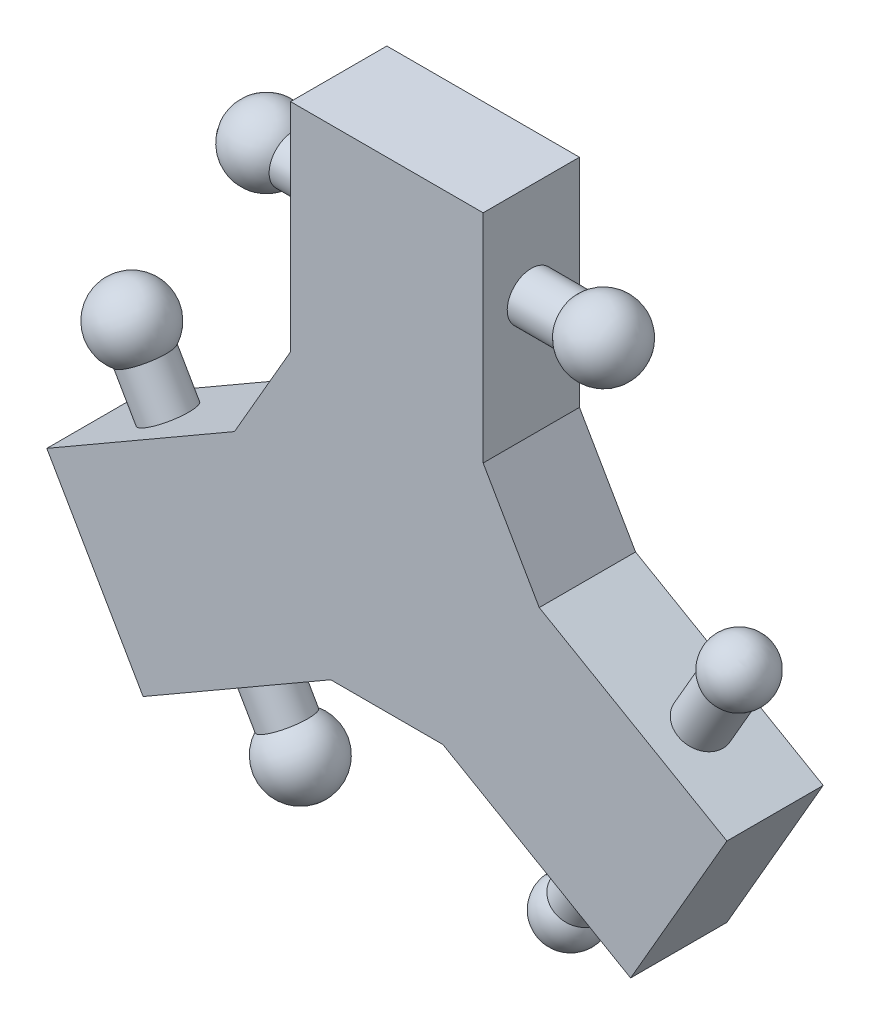
ISO-10303-21;
HEADER;
FILE_DESCRIPTION(('STEP AP214'),'2;1');
FILE_NAME('part.step','',(''),(''),'','','');
FILE_SCHEMA(('AUTOMOTIVE_DESIGN { 1 0 10303 214 1 1 1 1 }'));
ENDSEC;
DATA;
#1=APPLICATION_CONTEXT('core data for automotive mechanical design processes');
#2=APPLICATION_PROTOCOL_DEFINITION('international standard','automotive_design',2000,#1);
#3=PRODUCT_CONTEXT('',#1,'mechanical');
#4=PRODUCT('Part','Part','',(#3));
#5=PRODUCT_RELATED_PRODUCT_CATEGORY('part','',(#4));
#6=PRODUCT_DEFINITION_FORMATION('','',#4);
#7=PRODUCT_DEFINITION_CONTEXT('part definition',#1,'design');
#8=PRODUCT_DEFINITION('design','',#6,#7);
#9=PRODUCT_DEFINITION_SHAPE('','',#8);
#10=(LENGTH_UNIT() NAMED_UNIT(*) SI_UNIT(.MILLI.,.METRE.));
#11=(NAMED_UNIT(*) PLANE_ANGLE_UNIT() SI_UNIT($,.RADIAN.));
#12=(NAMED_UNIT(*) SI_UNIT($,.STERADIAN.) SOLID_ANGLE_UNIT());
#13=UNCERTAINTY_MEASURE_WITH_UNIT(LENGTH_MEASURE(1.E-05),#10,'distance_accuracy_value','');
#14=(GEOMETRIC_REPRESENTATION_CONTEXT(3) GLOBAL_UNCERTAINTY_ASSIGNED_CONTEXT((#13)) GLOBAL_UNIT_ASSIGNED_CONTEXT((#10,
#11,#12)) REPRESENTATION_CONTEXT('',''));
#15=CARTESIAN_POINT('',(0.,0.,0.));
#16=DIRECTION('',(0.,0.,1.));
#17=DIRECTION('',(1.,0.,0.));
#18=AXIS2_PLACEMENT_3D('',#15,#16,#17);
#19=CARTESIAN_POINT('',(-3.99999999999988,20.,4.));
#20=DIRECTION('',(1.,0.,0.));
#21=DIRECTION('',(0.,1.,0.));
#22=AXIS2_PLACEMENT_3D('',#19,#20,#21);
#23=PLANE('',#22);
#24=DIRECTION('',(0.,-1.,0.));
#25=VECTOR('',#24,1.);
#26=CARTESIAN_POINT('',(-3.99999999999988,20.,0.));
#27=LINE('',#26,#25);
#28=CARTESIAN_POINT('',(-3.99999999999988,20.,0.));
#29=VERTEX_POINT('',#28);
#30=CARTESIAN_POINT('',(-3.99999999999988,11.,0.));
#31=VERTEX_POINT('',#30);
#32=EDGE_CURVE('E164',#29,#31,#27,.T.);
#33=ORIENTED_EDGE('',*,*,#32,.T.);
#34=DIRECTION('',(0.,0.,-1.));
#35=VECTOR('',#34,1.);
#36=CARTESIAN_POINT('',(-3.99999999999988,11.,4.));
#37=LINE('',#36,#35);
#38=CARTESIAN_POINT('',(-3.99999999999988,11.,4.));
#39=VERTEX_POINT('',#38);
#40=EDGE_CURVE('E212',#39,#31,#37,.T.);
#41=ORIENTED_EDGE('',*,*,#40,.F.);
#42=DIRECTION('',(0.,-1.,0.));
#43=VECTOR('',#42,1.);
#44=CARTESIAN_POINT('',(-3.99999999999988,20.,4.));
#45=LINE('',#44,#43);
#46=CARTESIAN_POINT('',(-3.99999999999988,20.,4.));
#47=VERTEX_POINT('',#46);
#48=EDGE_CURVE('E187',#47,#39,#45,.T.);
#49=ORIENTED_EDGE('',*,*,#48,.F.);
#50=DIRECTION('',(0.,0.,-1.));
#51=VECTOR('',#50,1.);
#52=CARTESIAN_POINT('',(-3.99999999999988,20.,4.));
#53=LINE('',#52,#51);
#54=EDGE_CURVE('E160',#47,#29,#53,.T.);
#55=ORIENTED_EDGE('',*,*,#54,.T.);
#56=EDGE_LOOP('',(#33,#41,#49,#55));
#57=FACE_BOUND('',#56,.T.);
#58=CARTESIAN_POINT('',(-3.99999999999988,15.9999999999956,2.00000000000652));
#59=DIRECTION('',(1.,0.,0.));
#60=DIRECTION('',(0.,1.,0.));
#61=AXIS2_PLACEMENT_3D('',#58,#59,#60);
#62=CIRCLE('',#61,1.);
#63=CARTESIAN_POINT('',(-3.99999999999988,16.9999999999956,2.00000000000652));
#64=VERTEX_POINT('',#63);
#65=EDGE_CURVE('E11',#64,#64,#62,.F.);
#66=ORIENTED_EDGE('',*,*,#65,.F.);
#67=EDGE_LOOP('',(#66));
#68=FACE_BOUND('',#67,.T.);
#69=ADVANCED_FACE('F37',(#57,#68),#23,.F.);
#70=CARTESIAN_POINT('',(4.,20.,4.));
#71=DIRECTION('',(-1.,0.,0.));
#72=DIRECTION('',(0.,-1.,0.));
#73=AXIS2_PLACEMENT_3D('',#70,#71,#72);
#74=PLANE('',#73);
#75=DIRECTION('',(0.,1.,0.));
#76=VECTOR('',#75,1.);
#77=CARTESIAN_POINT('',(4.,20.,0.));
#78=LINE('',#77,#76);
#79=CARTESIAN_POINT('',(4.,11.,0.));
#80=VERTEX_POINT('',#79);
#81=CARTESIAN_POINT('',(4.,20.,0.));
#82=VERTEX_POINT('',#81);
#83=EDGE_CURVE('E99',#80,#82,#78,.T.);
#84=ORIENTED_EDGE('',*,*,#83,.T.);
#85=DIRECTION('',(0.,0.,-1.));
#86=VECTOR('',#85,1.);
#87=CARTESIAN_POINT('',(4.,20.,4.));
#88=LINE('',#87,#86);
#89=CARTESIAN_POINT('',(4.,20.,4.));
#90=VERTEX_POINT('',#89);
#91=EDGE_CURVE('E155',#90,#82,#88,.T.);
#92=ORIENTED_EDGE('',*,*,#91,.F.);
#93=DIRECTION('',(0.,1.,0.));
#94=VECTOR('',#93,1.);
#95=CARTESIAN_POINT('',(4.,20.,4.));
#96=LINE('',#95,#94);
#97=CARTESIAN_POINT('',(4.,11.,4.));
#98=VERTEX_POINT('',#97);
#99=EDGE_CURVE('E143',#98,#90,#96,.T.);
#100=ORIENTED_EDGE('',*,*,#99,.F.);
#101=DIRECTION('',(0.,0.,-1.));
#102=VECTOR('',#101,1.);
#103=CARTESIAN_POINT('',(4.,11.,4.));
#104=LINE('',#103,#102);
#105=EDGE_CURVE('E150',#98,#80,#104,.T.);
#106=ORIENTED_EDGE('',*,*,#105,.T.);
#107=EDGE_LOOP('',(#84,#92,#100,#106));
#108=FACE_BOUND('',#107,.T.);
#109=CARTESIAN_POINT('',(4.,15.9999999999956,2.00000000000653));
#110=DIRECTION('',(-1.,0.,0.));
#111=DIRECTION('',(0.,-1.,0.));
#112=AXIS2_PLACEMENT_3D('',#109,#110,#111);
#113=CIRCLE('',#112,0.999999999999983);
#114=CARTESIAN_POINT('',(4.,14.9999999999956,2.00000000000653));
#115=VERTEX_POINT('',#114);
#116=EDGE_CURVE('E50',#115,#115,#113,.F.);
#117=ORIENTED_EDGE('',*,*,#116,.F.);
#118=EDGE_LOOP('',(#117));
#119=FACE_BOUND('',#118,.T.);
#120=ADVANCED_FACE('F157',(#108,#119),#74,.F.);
#121=CARTESIAN_POINT('',(14.1243556529823,2.46410161513754,4.));
#122=DIRECTION('',(-0.5,-0.866025403784439,0.));
#123=DIRECTION('',(0.866025403784439,-0.5,0.));
#124=AXIS2_PLACEMENT_3D('',#121,#122,#123);
#125=PLANE('',#124);
#126=DIRECTION('',(-0.866025403784439,0.5,0.));
#127=VECTOR('',#126,1.);
#128=CARTESIAN_POINT('',(14.1243556529823,2.46410161513754,0.));
#129=LINE('',#128,#127);
#130=CARTESIAN_POINT('',(14.1243556529823,2.46410161513754,0.));
#131=VERTEX_POINT('',#130);
#132=CARTESIAN_POINT('',(6.33012701892232,6.96410161513754,0.));
#133=VERTEX_POINT('',#132);
#134=EDGE_CURVE('E182',#131,#133,#129,.T.);
#135=ORIENTED_EDGE('',*,*,#134,.T.);
#136=DIRECTION('',(0.,0.,-1.));
#137=VECTOR('',#136,1.);
#138=CARTESIAN_POINT('',(6.33012701892232,6.96410161513754,4.));
#139=LINE('',#138,#137);
#140=CARTESIAN_POINT('',(6.33012701892232,6.96410161513754,4.));
#141=VERTEX_POINT('',#140);
#142=EDGE_CURVE('E154',#141,#133,#139,.T.);
#143=ORIENTED_EDGE('',*,*,#142,.F.);
#144=DIRECTION('',(-0.866025403784439,0.5,0.));
#145=VECTOR('',#144,1.);
#146=CARTESIAN_POINT('',(14.1243556529823,2.46410161513754,4.));
#147=LINE('',#146,#145);
#148=CARTESIAN_POINT('',(14.1243556529823,2.46410161513754,4.));
#149=VERTEX_POINT('',#148);
#150=EDGE_CURVE('E145',#149,#141,#147,.T.);
#151=ORIENTED_EDGE('',*,*,#150,.F.);
#152=DIRECTION('',(0.,0.,-1.));
#153=VECTOR('',#152,1.);
#154=CARTESIAN_POINT('',(14.1243556529823,2.46410161513754,4.));
#155=LINE('',#154,#153);
#156=EDGE_CURVE('E191',#149,#131,#155,.T.);
#157=ORIENTED_EDGE('',*,*,#156,.T.);
#158=EDGE_LOOP('',(#135,#143,#151,#157));
#159=FACE_BOUND('',#158,.T.);
#160=CARTESIAN_POINT('',(11.0932667397321,4.21410161514022,2.00000000000478));
#161=DIRECTION('',(-0.5,-0.866025403784439,0.));
#162=DIRECTION('',(0.866025403784439,-0.5,0.));
#163=AXIS2_PLACEMENT_3D('',#160,#161,#162);
#164=CIRCLE('',#163,0.999999999999996);
#165=CARTESIAN_POINT('',(11.9592921435165,3.71410161514022,2.00000000000478));
#166=VERTEX_POINT('',#165);
#167=EDGE_CURVE('E266',#166,#166,#164,.F.);
#168=ORIENTED_EDGE('',*,*,#167,.F.);
#169=EDGE_LOOP('',(#168));
#170=FACE_BOUND('',#169,.T.);
#171=ADVANCED_FACE('F291',(#159,#170),#125,.F.);
#172=CARTESIAN_POINT('',(-14.1243556529821,2.46410161513754,4.));
#173=DIRECTION('',(0.5,-0.866025403784439,0.));
#174=DIRECTION('',(0.866025403784439,0.5,0.));
#175=AXIS2_PLACEMENT_3D('',#172,#173,#174);
#176=PLANE('',#175);
#177=DIRECTION('',(-0.866025403784439,-0.5,0.));
#178=VECTOR('',#177,1.);
#179=CARTESIAN_POINT('',(-14.1243556529821,2.46410161513754,0.));
#180=LINE('',#179,#178);
#181=CARTESIAN_POINT('',(-6.33012701892219,6.96410161513754,0.));
#182=VERTEX_POINT('',#181);
#183=CARTESIAN_POINT('',(-14.1243556529821,2.46410161513754,0.));
#184=VERTEX_POINT('',#183);
#185=EDGE_CURVE('E170',#182,#184,#180,.T.);
#186=ORIENTED_EDGE('',*,*,#185,.T.);
#187=DIRECTION('',(0.,0.,-1.));
#188=VECTOR('',#187,1.);
#189=CARTESIAN_POINT('',(-14.1243556529821,2.46410161513754,4.));
#190=LINE('',#189,#188);
#191=CARTESIAN_POINT('',(-14.1243556529821,2.46410161513754,4.));
#192=VERTEX_POINT('',#191);
#193=EDGE_CURVE('E206',#192,#184,#190,.T.);
#194=ORIENTED_EDGE('',*,*,#193,.F.);
#195=DIRECTION('',(-0.866025403784439,-0.5,0.));
#196=VECTOR('',#195,1.);
#197=CARTESIAN_POINT('',(-14.1243556529821,2.46410161513754,4.));
#198=LINE('',#197,#196);
#199=CARTESIAN_POINT('',(-6.33012701892219,6.96410161513754,4.));
#200=VERTEX_POINT('',#199);
#201=EDGE_CURVE('E574',#200,#192,#198,.T.);
#202=ORIENTED_EDGE('',*,*,#201,.F.);
#203=DIRECTION('',(0.,0.,-1.));
#204=VECTOR('',#203,1.);
#205=CARTESIAN_POINT('',(-6.33012701892219,6.96410161513754,4.));
#206=LINE('',#205,#204);
#207=EDGE_CURVE('E209',#200,#182,#206,.T.);
#208=ORIENTED_EDGE('',*,*,#207,.T.);
#209=EDGE_LOOP('',(#186,#194,#202,#208));
#210=FACE_BOUND('',#209,.T.);
#211=CARTESIAN_POINT('',(-11.093266739732,4.21410161514019,2.00000000000477));
#212=DIRECTION('',(0.5,-0.866025403784439,0.));
#213=DIRECTION('',(0.866025403784439,0.5,0.));
#214=AXIS2_PLACEMENT_3D('',#211,#212,#213);
#215=CIRCLE('',#214,1.00000000000002);
#216=CARTESIAN_POINT('',(-10.2272413359476,4.7141016151402,2.00000000000477));
#217=VERTEX_POINT('',#216);
#218=EDGE_CURVE('E220',#217,#217,#215,.F.);
#219=ORIENTED_EDGE('',*,*,#218,.F.);
#220=EDGE_LOOP('',(#219));
#221=FACE_BOUND('',#220,.T.);
#222=ADVANCED_FACE('F317',(#210,#221),#176,.F.);
#223=CARTESIAN_POINT('',(10.1243556529823,-4.46410161513786,4.));
#224=DIRECTION('',(0.5,0.866025403784439,0.));
#225=DIRECTION('',(-0.866025403784439,0.5,0.));
#226=AXIS2_PLACEMENT_3D('',#223,#224,#225);
#227=PLANE('',#226);
#228=DIRECTION('',(0.866025403784439,-0.5,0.));
#229=VECTOR('',#228,1.);
#230=CARTESIAN_POINT('',(10.1243556529823,-4.46410161513786,0.));
#231=LINE('',#230,#229);
#232=CARTESIAN_POINT('',(2.33012701892238,0.0358983848621347,0.));
#233=VERTEX_POINT('',#232);
#234=CARTESIAN_POINT('',(10.1243556529823,-4.46410161513786,0.));
#235=VERTEX_POINT('',#234);
#236=EDGE_CURVE('E178',#233,#235,#231,.T.);
#237=ORIENTED_EDGE('',*,*,#236,.T.);
#238=DIRECTION('',(0.,0.,-1.));
#239=VECTOR('',#238,1.);
#240=CARTESIAN_POINT('',(10.1243556529823,-4.46410161513786,4.));
#241=LINE('',#240,#239);
#242=CARTESIAN_POINT('',(10.1243556529823,-4.46410161513786,4.));
#243=VERTEX_POINT('',#242);
#244=EDGE_CURVE('E194',#243,#235,#241,.T.);
#245=ORIENTED_EDGE('',*,*,#244,.F.);
#246=DIRECTION('',(0.866025403784439,-0.5,0.));
#247=VECTOR('',#246,1.);
#248=CARTESIAN_POINT('',(10.1243556529823,-4.46410161513786,4.));
#249=LINE('',#248,#247);
#250=CARTESIAN_POINT('',(2.33012701892238,0.0358983848621347,4.));
#251=VERTEX_POINT('',#250);
#252=EDGE_CURVE('E561',#251,#243,#249,.T.);
#253=ORIENTED_EDGE('',*,*,#252,.F.);
#254=DIRECTION('',(0.,0.,-1.));
#255=VECTOR('',#254,1.);
#256=CARTESIAN_POINT('',(2.33012701892238,0.0358983848621347,4.));
#257=LINE('',#256,#255);
#258=EDGE_CURVE('E197',#251,#233,#257,.T.);
#259=ORIENTED_EDGE('',*,*,#258,.T.);
#260=EDGE_LOOP('',(#237,#245,#253,#259));
#261=FACE_BOUND('',#260,.T.);
#262=CARTESIAN_POINT('',(7.09326673973215,-2.71410161513519,2.00000000000477));
#263=DIRECTION('',(0.5,0.866025403784439,0.));
#264=DIRECTION('',(-0.866025403784439,0.5,0.));
#265=AXIS2_PLACEMENT_3D('',#262,#263,#264);
#266=CIRCLE('',#265,1.);
#267=CARTESIAN_POINT('',(6.22724133594771,-2.21410161513519,2.00000000000477));
#268=VERTEX_POINT('',#267);
#269=EDGE_CURVE('E217',#268,#268,#266,.F.);
#270=ORIENTED_EDGE('',*,*,#269,.F.);
#271=EDGE_LOOP('',(#270));
#272=FACE_BOUND('',#271,.T.);
#273=ADVANCED_FACE('F313',(#261,#272),#227,.F.);
#274=CARTESIAN_POINT('',(-10.1243556529822,-4.46410161513786,4.));
#275=DIRECTION('',(-0.499999999999999,0.866025403784439,0.));
#276=DIRECTION('',(-0.866025403784439,-0.5,0.));
#277=AXIS2_PLACEMENT_3D('',#274,#275,#276);
#278=PLANE('',#277);
#279=DIRECTION('',(0.866025403784439,0.499999999999999,0.));
#280=VECTOR('',#279,1.);
#281=CARTESIAN_POINT('',(-10.1243556529822,-4.46410161513786,0.));
#282=LINE('',#281,#280);
#283=CARTESIAN_POINT('',(-10.1243556529822,-4.46410161513786,0.));
#284=VERTEX_POINT('',#283);
#285=CARTESIAN_POINT('',(-2.33012701892226,0.0358983848621364,0.));
#286=VERTEX_POINT('',#285);
#287=EDGE_CURVE('E174',#284,#286,#282,.T.);
#288=ORIENTED_EDGE('',*,*,#287,.T.);
#289=DIRECTION('',(0.,0.,-1.));
#290=VECTOR('',#289,1.);
#291=CARTESIAN_POINT('',(-2.33012701892226,0.0358983848621364,4.));
#292=LINE('',#291,#290);
#293=CARTESIAN_POINT('',(-2.33012701892226,0.0358983848621364,4.));
#294=VERTEX_POINT('',#293);
#295=EDGE_CURVE('E200',#294,#286,#292,.T.);
#296=ORIENTED_EDGE('',*,*,#295,.F.);
#297=DIRECTION('',(0.866025403784439,0.499999999999999,0.));
#298=VECTOR('',#297,1.);
#299=CARTESIAN_POINT('',(-10.1243556529822,-4.46410161513786,4.));
#300=LINE('',#299,#298);
#301=CARTESIAN_POINT('',(-10.1243556529822,-4.46410161513786,4.));
#302=VERTEX_POINT('',#301);
#303=EDGE_CURVE('E569',#302,#294,#300,.T.);
#304=ORIENTED_EDGE('',*,*,#303,.F.);
#305=DIRECTION('',(0.,0.,-1.));
#306=VECTOR('',#305,1.);
#307=CARTESIAN_POINT('',(-10.1243556529822,-4.46410161513786,4.));
#308=LINE('',#307,#306);
#309=EDGE_CURVE('E203',#302,#284,#308,.T.);
#310=ORIENTED_EDGE('',*,*,#309,.T.);
#311=EDGE_LOOP('',(#288,#296,#304,#310));
#312=FACE_BOUND('',#311,.T.);
#313=CARTESIAN_POINT('',(-7.09326673973211,-2.71410161513523,2.00000000000477));
#314=DIRECTION('',(-0.499999999999999,0.866025403784439,0.));
#315=DIRECTION('',(-0.866025403784439,-0.5,0.));
#316=AXIS2_PLACEMENT_3D('',#313,#314,#315);
#317=CIRCLE('',#316,1.);
#318=CARTESIAN_POINT('',(-7.95929214351655,-3.21410161513523,2.00000000000477));
#319=VERTEX_POINT('',#318);
#320=EDGE_CURVE('E214',#319,#319,#317,.F.);
#321=ORIENTED_EDGE('',*,*,#320,.F.);
#322=EDGE_LOOP('',(#321));
#323=FACE_BOUND('',#322,.T.);
#324=ADVANCED_FACE('F305',(#312,#323),#278,.F.);
#325=CARTESIAN_POINT('',(-6.33012701892219,6.96410161513754,4.));
#326=DIRECTION('',(0.866025403784438,-0.5,0.));
#327=DIRECTION('',(0.5,0.866025403784439,0.));
#328=AXIS2_PLACEMENT_3D('',#325,#326,#327);
#329=PLANE('',#328);
#330=DIRECTION('',(-0.5,-0.866025403784438,0.));
#331=VECTOR('',#330,1.);
#332=CARTESIAN_POINT('',(-6.33012701892219,6.96410161513754,0.));
#333=LINE('',#332,#331);
#334=EDGE_CURVE('E167',#31,#182,#333,.T.);
#335=ORIENTED_EDGE('',*,*,#334,.T.);
#336=ORIENTED_EDGE('',*,*,#207,.F.);
#337=DIRECTION('',(-0.5,-0.866025403784438,0.));
#338=VECTOR('',#337,1.);
#339=CARTESIAN_POINT('',(-6.33012701892219,6.96410161513754,4.));
#340=LINE('',#339,#338);
#341=EDGE_CURVE('E114',#39,#200,#340,.T.);
#342=ORIENTED_EDGE('',*,*,#341,.F.);
#343=ORIENTED_EDGE('',*,*,#40,.T.);
#344=EDGE_LOOP('',(#335,#336,#342,#343));
#345=FACE_BOUND('',#344,.T.);
#346=ADVANCED_FACE('F302',(#345),#329,.F.);
#347=CARTESIAN_POINT('',(-10.1243556529822,-4.46410161513786,4.));
#348=DIRECTION('',(0.866025403784439,0.5,0.));
#349=DIRECTION('',(-0.5,0.866025403784439,0.));
#350=AXIS2_PLACEMENT_3D('',#347,#348,#349);
#351=PLANE('',#350);
#352=DIRECTION('',(0.5,-0.866025403784439,0.));
#353=VECTOR('',#352,1.);
#354=CARTESIAN_POINT('',(-10.1243556529822,-4.46410161513786,0.));
#355=LINE('',#354,#353);
#356=EDGE_CURVE('E172',#184,#284,#355,.T.);
#357=ORIENTED_EDGE('',*,*,#356,.T.);
#358=ORIENTED_EDGE('',*,*,#309,.F.);
#359=DIRECTION('',(0.5,-0.866025403784439,0.));
#360=VECTOR('',#359,1.);
#361=CARTESIAN_POINT('',(-10.1243556529822,-4.46410161513786,4.));
#362=LINE('',#361,#360);
#363=EDGE_CURVE('E571',#192,#302,#362,.T.);
#364=ORIENTED_EDGE('',*,*,#363,.F.);
#365=ORIENTED_EDGE('',*,*,#193,.T.);
#366=EDGE_LOOP('',(#357,#358,#364,#365));
#367=FACE_BOUND('',#366,.T.);
#368=ADVANCED_FACE('F304',(#367),#351,.F.);
#369=CARTESIAN_POINT('',(2.33012701892238,0.0358983848621347,4.));
#370=DIRECTION('',(0.,1.,0.));
#371=DIRECTION('',(-1.,0.,0.));
#372=AXIS2_PLACEMENT_3D('',#369,#370,#371);
#373=PLANE('',#372);
#374=DIRECTION('',(1.,0.,0.));
#375=VECTOR('',#374,1.);
#376=CARTESIAN_POINT('',(2.33012701892238,0.0358983848621347,0.));
#377=LINE('',#376,#375);
#378=EDGE_CURVE('E176',#286,#233,#377,.T.);
#379=ORIENTED_EDGE('',*,*,#378,.T.);
#380=ORIENTED_EDGE('',*,*,#258,.F.);
#381=DIRECTION('',(1.,0.,0.));
#382=VECTOR('',#381,1.);
#383=CARTESIAN_POINT('',(2.33012701892238,0.0358983848621347,4.));
#384=LINE('',#383,#382);
#385=EDGE_CURVE('E564',#294,#251,#384,.T.);
#386=ORIENTED_EDGE('',*,*,#385,.F.);
#387=ORIENTED_EDGE('',*,*,#295,.T.);
#388=EDGE_LOOP('',(#379,#380,#386,#387));
#389=FACE_BOUND('',#388,.T.);
#390=ADVANCED_FACE('F310',(#389),#373,.F.);
#391=CARTESIAN_POINT('',(14.1243556529823,2.46410161513754,4.));
#392=DIRECTION('',(-0.866025403784439,0.5,0.));
#393=DIRECTION('',(-0.5,-0.866025403784439,0.));
#394=AXIS2_PLACEMENT_3D('',#391,#392,#393);
#395=PLANE('',#394);
#396=DIRECTION('',(0.5,0.866025403784439,0.));
#397=VECTOR('',#396,1.);
#398=CARTESIAN_POINT('',(14.1243556529823,2.46410161513754,0.));
#399=LINE('',#398,#397);
#400=EDGE_CURVE('E180',#235,#131,#399,.T.);
#401=ORIENTED_EDGE('',*,*,#400,.T.);
#402=ORIENTED_EDGE('',*,*,#156,.F.);
#403=DIRECTION('',(0.5,0.866025403784439,0.));
#404=VECTOR('',#403,1.);
#405=CARTESIAN_POINT('',(14.1243556529823,2.46410161513754,4.));
#406=LINE('',#405,#404);
#407=EDGE_CURVE('E559',#243,#149,#406,.T.);
#408=ORIENTED_EDGE('',*,*,#407,.F.);
#409=ORIENTED_EDGE('',*,*,#244,.T.);
#410=EDGE_LOOP('',(#401,#402,#408,#409));
#411=FACE_BOUND('',#410,.T.);
#412=ADVANCED_FACE('F323',(#411),#395,.F.);
#413=CARTESIAN_POINT('',(4.,11.,4.));
#414=DIRECTION('',(-0.866025403784439,-0.5,0.));
#415=DIRECTION('',(0.5,-0.866025403784439,0.));
#416=AXIS2_PLACEMENT_3D('',#413,#414,#415);
#417=PLANE('',#416);
#418=DIRECTION('',(-0.5,0.866025403784439,0.));
#419=VECTOR('',#418,1.);
#420=CARTESIAN_POINT('',(4.,11.,0.));
#421=LINE('',#420,#419);
#422=EDGE_CURVE('E153',#133,#80,#421,.T.);
#423=ORIENTED_EDGE('',*,*,#422,.T.);
#424=ORIENTED_EDGE('',*,*,#105,.F.);
#425=DIRECTION('',(-0.5,0.866025403784439,0.));
#426=VECTOR('',#425,1.);
#427=CARTESIAN_POINT('',(4.,11.,4.));
#428=LINE('',#427,#426);
#429=EDGE_CURVE('E139',#141,#98,#428,.T.);
#430=ORIENTED_EDGE('',*,*,#429,.F.);
#431=ORIENTED_EDGE('',*,*,#142,.T.);
#432=EDGE_LOOP('',(#423,#424,#430,#431));
#433=FACE_BOUND('',#432,.T.);
#434=ADVANCED_FACE('F151',(#433),#417,.F.);
#435=CARTESIAN_POINT('',(-3.99999999999988,20.,4.));
#436=DIRECTION('',(0.,-1.,0.));
#437=DIRECTION('',(0.,0.,-1.));
#438=AXIS2_PLACEMENT_3D('',#435,#436,#437);
#439=PLANE('',#438);
#440=DIRECTION('',(-1.,0.,0.));
#441=VECTOR('',#440,1.);
#442=CARTESIAN_POINT('',(-3.99999999999988,20.,0.));
#443=LINE('',#442,#441);
#444=EDGE_CURVE('E105',#82,#29,#443,.T.);
#445=ORIENTED_EDGE('',*,*,#444,.T.);
#446=ORIENTED_EDGE('',*,*,#54,.F.);
#447=DIRECTION('',(-1.,0.,0.));
#448=VECTOR('',#447,1.);
#449=CARTESIAN_POINT('',(-3.99999999999988,20.,4.));
#450=LINE('',#449,#448);
#451=EDGE_CURVE('E58',#90,#47,#450,.T.);
#452=ORIENTED_EDGE('',*,*,#451,.F.);
#453=ORIENTED_EDGE('',*,*,#91,.T.);
#454=EDGE_LOOP('',(#445,#446,#452,#453));
#455=FACE_BOUND('',#454,.T.);
#456=ADVANCED_FACE('F335',(#455),#439,.F.);
#457=CARTESIAN_POINT('',(-3.99999999999988,0.0358983848621371,4.));
#458=DIRECTION('',(0.,0.,-1.));
#459=DIRECTION('',(-1.,0.,0.));
#460=AXIS2_PLACEMENT_3D('',#457,#458,#459);
#461=PLANE('',#460);
#462=ORIENTED_EDGE('',*,*,#48,.T.);
#463=ORIENTED_EDGE('',*,*,#341,.T.);
#464=ORIENTED_EDGE('',*,*,#201,.T.);
#465=ORIENTED_EDGE('',*,*,#363,.T.);
#466=ORIENTED_EDGE('',*,*,#303,.T.);
#467=ORIENTED_EDGE('',*,*,#385,.T.);
#468=ORIENTED_EDGE('',*,*,#252,.T.);
#469=ORIENTED_EDGE('',*,*,#407,.T.);
#470=ORIENTED_EDGE('',*,*,#150,.T.);
#471=ORIENTED_EDGE('',*,*,#429,.T.);
#472=ORIENTED_EDGE('',*,*,#99,.T.);
#473=ORIENTED_EDGE('',*,*,#451,.T.);
#474=EDGE_LOOP('',(#462,#463,#464,#465,#466,#467,#468,#469,#470,#471,#472,#473));
#475=FACE_BOUND('',#474,.T.);
#476=ADVANCED_FACE('F141',(#475),#461,.F.);
#477=CARTESIAN_POINT('',(-3.99999999999988,0.0358983848621371,0.));
#478=DIRECTION('',(0.,0.,-1.));
#479=DIRECTION('',(-1.,0.,0.));
#480=AXIS2_PLACEMENT_3D('',#477,#478,#479);
#481=PLANE('',#480);
#482=ORIENTED_EDGE('',*,*,#32,.F.);
#483=ORIENTED_EDGE('',*,*,#444,.F.);
#484=ORIENTED_EDGE('',*,*,#83,.F.);
#485=ORIENTED_EDGE('',*,*,#422,.F.);
#486=ORIENTED_EDGE('',*,*,#134,.F.);
#487=ORIENTED_EDGE('',*,*,#400,.F.);
#488=ORIENTED_EDGE('',*,*,#236,.F.);
#489=ORIENTED_EDGE('',*,*,#378,.F.);
#490=ORIENTED_EDGE('',*,*,#287,.F.);
#491=ORIENTED_EDGE('',*,*,#356,.F.);
#492=ORIENTED_EDGE('',*,*,#185,.F.);
#493=ORIENTED_EDGE('',*,*,#334,.F.);
#494=EDGE_LOOP('',(#482,#483,#484,#485,#486,#487,#488,#489,#490,#491,#492,#493));
#495=FACE_BOUND('',#494,.T.);
#496=ADVANCED_FACE('F299',(#495),#481,.T.);
#497=CARTESIAN_POINT('',(-5.59326673973216,-5.3121778264885,2.00000000000477));
#498=DIRECTION('',(-0.499999999999992,0.866025403784443,0.));
#499=DIRECTION('',(-0.866025403784443,-0.499999999999992,0.));
#500=AXIS2_PLACEMENT_3D('',#497,#498,#499);
#501=CYLINDRICAL_SURFACE('',#500,1.);
#502=CARTESIAN_POINT('',(-6.1522837341071,-4.34393198993664,2.00000000000477));
#503=DIRECTION('',(0.499999999999992,-0.866025403784443,0.));
#504=DIRECTION('',(0.866025403784443,0.499999999999992,0.));
#505=AXIS2_PLACEMENT_3D('',#502,#503,#504);
#506=CIRCLE('',#505,1.);
#507=CARTESIAN_POINT('',(-5.28625833032266,-3.84393198993665,2.00000000000477));
#508=VERTEX_POINT('',#507);
#509=EDGE_CURVE('E227',#508,#508,#506,.F.);
#510=ORIENTED_EDGE('',*,*,#509,.T.);
#511=EDGE_LOOP('',(#510));
#512=FACE_BOUND('',#511,.T.);
#513=ORIENTED_EDGE('',*,*,#320,.T.);
#514=EDGE_LOOP('',(#513));
#515=FACE_BOUND('',#514,.T.);
#516=ADVANCED_FACE('F341',(#512,#515),#501,.T.);
#517=CARTESIAN_POINT('',(7.39711431702554,-2.18782217350633,2.00000000000477));
#518=DIRECTION('',(-0.500000000000004,-0.866025403784436,0.));
#519=DIRECTION('',(0.866025403784437,-0.500000000000004,0.));
#520=AXIS2_PLACEMENT_3D('',#517,#518,#519);
#521=CYLINDRICAL_SURFACE('',#520,1.);
#522=CARTESIAN_POINT('',(5.33037361920741,-4.19631053775157,1.38127261120716));
#523=CARTESIAN_POINT('',(5.29925082863127,-4.18065834607517,1.42543628601472));
#524=CARTESIAN_POINT('',(5.27122438968413,-4.16706742046409,1.47256532667118));
#525=CARTESIAN_POINT('',(5.22218393591401,-4.14441951531334,1.57139548956086));
#526=CARTESIAN_POINT('',(5.20117854844693,-4.13536810707861,1.62310213877394));
#527=CARTESIAN_POINT('',(5.16680405420839,-4.12208140377556,1.72955452362346));
#528=CARTESIAN_POINT('',(5.15343072308337,-4.11784344316859,1.78429855961402));
#529=CARTESIAN_POINT('',(5.13467593487026,-4.11430223057149,1.89527857371114));
#530=CARTESIAN_POINT('',(5.12929249685137,-4.11499775517724,1.95151417849313));
#531=CARTESIAN_POINT('',(5.12665010301997,-4.12130859342483,2.06397853341365));
#532=CARTESIAN_POINT('',(5.12940239299181,-4.12693070939891,2.1202071665244));
#533=CARTESIAN_POINT('',(5.14297153993211,-4.14294791784385,2.2309888800131));
#534=CARTESIAN_POINT('',(5.15378878152509,-4.15334323794385,2.28554188034947));
#535=CARTESIAN_POINT('',(5.18319692062777,-4.17862861532806,2.39148849522352));
#536=CARTESIAN_POINT('',(5.20179696851124,-4.19352395761316,2.44287830889991));
#537=CARTESIAN_POINT('',(5.24624634858243,-4.2273813491611,2.54096946871186));
#538=CARTESIAN_POINT('',(5.27209568547092,-4.24634340106099,2.58767081180717));
#539=CARTESIAN_POINT('',(5.33031794218176,-4.28779328199254,2.67505857211303));
#540=CARTESIAN_POINT('',(5.36269115535867,-4.3102812695624,2.71574471869977));
#541=CARTESIAN_POINT('',(5.43305015969933,-4.35813681743488,2.78993738590193));
#542=CARTESIAN_POINT('',(5.47103591134674,-4.38350435746308,2.8234439570627));
#543=CARTESIAN_POINT('',(5.55149790065517,-4.43635371460272,2.88227766281534));
#544=CARTESIAN_POINT('',(5.59396828798506,-4.46383276474657,2.90761528323092));
#545=CARTESIAN_POINT('',(5.68224197374829,-4.52014090953786,2.94943917257478));
#546=CARTESIAN_POINT('',(5.72804523710258,-4.54896998997486,2.96592553464866));
#547=CARTESIAN_POINT('',(5.82158566918424,-4.60708161689478,2.98954156196927));
#548=CARTESIAN_POINT('',(5.86931844513348,-4.63636304888641,2.99669136878903));
#549=CARTESIAN_POINT('',(5.96545755939009,-4.69459660620103,3.00148863115412));
#550=CARTESIAN_POINT('',(6.01386388901574,-4.7235487357598,2.9991362090647));
#551=CARTESIAN_POINT('',(6.10987648263052,-4.78023459242053,2.98500561013727));
#552=CARTESIAN_POINT('',(6.15748415430616,-4.80797064266553,2.97324631258871));
#553=CARTESIAN_POINT('',(6.25064569998564,-4.86149553766449,2.94065880588333));
#554=CARTESIAN_POINT('',(6.2961995869469,-4.88728439470407,2.91983065395115));
#555=CARTESIAN_POINT('',(6.38392413492046,-4.93616696730115,2.86971917344187));
#556=CARTESIAN_POINT('',(6.42609733815387,-4.95926271409168,2.84044227586711));
#557=CARTESIAN_POINT('',(6.50590176213571,-5.00213625207258,2.77426246744914));
#558=CARTESIAN_POINT('',(6.5435329692666,-5.02191403331529,2.7373595337429));
#559=CARTESIAN_POINT('',(6.61321895652803,-5.05762193165465,2.65694170837863));
#560=CARTESIAN_POINT('',(6.64526859559018,-5.07354850667356,2.61342078940748));
#561=CARTESIAN_POINT('',(6.70284239223096,-5.10109653163388,2.52102922667072));
#562=CARTESIAN_POINT('',(6.72836648164398,-5.11271793660424,2.47215852702915));
#563=CARTESIAN_POINT('',(6.77221451453301,-5.13136361087033,2.37034630474444));
#564=CARTESIAN_POINT('',(6.79052347512466,-5.13837833387329,2.31739658120629));
#565=CARTESIAN_POINT('',(6.81934944297112,-5.14758898976556,2.20901526648349));
#566=CARTESIAN_POINT('',(6.82986635752579,-5.14978486532679,2.15358364578063));
#567=CARTESIAN_POINT('',(6.842826015959,-5.14930646317381,2.04168621063752));
#568=CARTESIAN_POINT('',(6.84525165463711,-5.14662188651087,1.98521845867945));
#569=CARTESIAN_POINT('',(6.84191284082882,-5.136444773078,1.8729622934194));
#570=CARTESIAN_POINT('',(6.83614831951405,-5.12895219590296,1.81717388583046));
#571=CARTESIAN_POINT('',(6.81658079916826,-5.10936044098458,1.70779130128871));
#572=CARTESIAN_POINT('',(6.80276834096903,-5.09725584829784,1.65419978593051));
#573=CARTESIAN_POINT('',(6.76748908405296,-5.06878016039502,1.55080326589328));
#574=CARTESIAN_POINT('',(6.74602228569327,-5.05240906537801,1.50099826103756));
#575=CARTESIAN_POINT('',(6.69604754164565,-5.015860144921,1.40660014369489));
#576=CARTESIAN_POINT('',(6.66754072247304,-4.99568292864282,1.36200619903563));
#577=CARTESIAN_POINT('',(6.60429450535346,-4.9520829703755,1.27929445599892));
#578=CARTESIAN_POINT('',(6.56955513069298,-4.92866024051254,1.241176633426));
#579=CARTESIAN_POINT('',(6.49488178017039,-4.87925616979362,1.17255391484618));
#580=CARTESIAN_POINT('',(6.45495449854642,-4.85327813650305,1.14203935348542));
#581=CARTESIAN_POINT('',(6.37100893893167,-4.79946626312675,1.08943670197423));
#582=CARTESIAN_POINT('',(6.32699069079648,-4.77163243658491,1.06734855033443));
#583=CARTESIAN_POINT('',(6.23620113883291,-4.7149426081798,1.03226761368848));
#584=CARTESIAN_POINT('',(6.1894348168642,-4.68608849161353,1.01925888885188));
#585=CARTESIAN_POINT('',(6.09441487027572,-4.62812635931469,1.00265180776188));
#586=CARTESIAN_POINT('',(6.04616131805161,-4.59901835599017,0.999052994180737));
#587=CARTESIAN_POINT('',(5.94962434933963,-4.54142011099083,1.0013698780664));
#588=CARTESIAN_POINT('',(5.90134111819723,-4.51292891639044,1.00726965172903));
#589=CARTESIAN_POINT('',(5.80602507797393,-4.45731380840343,1.02839269388277));
#590=CARTESIAN_POINT('',(5.75899257629765,-4.4301902297085,1.04361823276343));
#591=CARTESIAN_POINT('',(5.66754716511425,-4.37810016802779,1.08295004556579));
#592=CARTESIAN_POINT('',(5.62313343469724,-4.35313300791343,1.10705351915448));
#593=CARTESIAN_POINT('',(5.53820317684166,-4.30607744765697,1.16343983006158));
#594=CARTESIAN_POINT('',(5.49768201075371,-4.28398560964924,1.19571276101287));
#595=CARTESIAN_POINT('',(5.43603261227361,-4.25098894133466,1.25391207565989));
#596=CARTESIAN_POINT('',(5.4133596444908,-4.23901001427781,1.27763264908908));
#597=CARTESIAN_POINT('',(5.37018501905237,-4.21652641485025,1.32761252102655));
#598=CARTESIAN_POINT('',(5.34968336048022,-4.20602174185726,1.35387181846322));
#599=CARTESIAN_POINT('',(5.33037361920741,-4.19631053775157,1.38127261120716));
#600=B_SPLINE_CURVE_WITH_KNOTS('',3,(#522,#523,#524,#525,#526,#527,#528,#529,#530,#531,#532,
#533,#534,#535,#536,#537,#538,#539,#540,#541,#542,#543,#544,#545,#546,#547,#548,#549,#550,#551,
#552,#553,#554,#555,#556,#557,#558,#559,#560,#561,#562,#563,#564,#565,#566,#567,#568,#569,#570,
#571,#572,#573,#574,#575,#576,#577,#578,#579,#580,#581,#582,#583,#584,#585,#586,#587,#588,#589,
#590,#591,#592,#593,#594,#595,#596,#597,#598,#599),.UNSPECIFIED.,.T.,.F.,(4,2,2,2,2,2,2,2,2,2,2,
2,2,2,2,2,2,2,2,2,2,2,2,2,2,2,2,2,2,2,2,2,2,2,2,2,2,2,4),(0.,0.16862197538188,0.337450395503498,
0.506185278006256,0.674878319148543,0.843804648851738,1.01273903531305,1.1818726012996,
1.35100627696053,1.5201475596348,1.68928765148873,1.85820975934468,2.02713008952574,
2.19568540577344,2.36423855145163,2.53245426266564,2.70066891245061,2.86875585709809,
3.03684330568119,3.20508476662837,3.3733279849468,3.54191875775832,3.71051153622207,
3.87946049977179,4.04841088314097,4.21756024460313,4.38670959817298,4.55583190267369,
4.72495357530194,4.89385914889142,5.06276348991603,5.23137055170644,5.39996941893272,
5.56828593459717,5.73664344379128,5.90494789403374,6.07304922614018,6.17766863949178,
6.28228800868256),.UNSPECIFIED.);
#601=CARTESIAN_POINT('',(5.33037361920741,-4.19631053775157,1.38127261120716));
#602=VERTEX_POINT('',#601);
#603=EDGE_CURVE('E168',#602,#602,#600,.T.);
#604=ORIENTED_EDGE('',*,*,#603,.T.);
#605=EDGE_LOOP('',(#604));
#606=FACE_BOUND('',#605,.T.);
#607=ORIENTED_EDGE('',*,*,#269,.T.);
#608=EDGE_LOOP('',(#607));
#609=FACE_BOUND('',#608,.T.);
#610=ADVANCED_FACE('F229',(#606,#609),#521,.T.);
#611=CARTESIAN_POINT('',(5.58190520301963,-5.30561824020916,1.95174097657066));
#612=DIRECTION('',(0.,0.,-1.));
#613=DIRECTION('',(-0.866025403784436,0.500000000000004,0.));
#614=AXIS2_PLACEMENT_3D('',#611,#612,#613);
#615=SPHERICAL_SURFACE('',#614,1.27250378084599);
#616=ORIENTED_EDGE('',*,*,#603,.F.);
#617=EDGE_LOOP('',(#616));
#618=FACE_BOUND('',#617,.T.);
#619=ADVANCED_FACE('F232',(#618),#615,.T.);
#620=CARTESIAN_POINT('',(-5.59326673973216,-5.3121778264885,2.00000000000477));
#621=DIRECTION('',(0.,0.,-1.));
#622=DIRECTION('',(-0.866025403784443,-0.499999999999992,0.));
#623=AXIS2_PLACEMENT_3D('',#620,#621,#622);
#624=SPHERICAL_SURFACE('',#623,1.5);
#625=CARTESIAN_POINT('',(-5.59326673973216,-5.3121778264885,2.00000000000477));
#626=DIRECTION('',(0.499999999999992,-0.866025403784443,0.));
#627=DIRECTION('',(0.866025403784443,0.499999999999992,0.));
#628=AXIS2_PLACEMENT_3D('',#625,#626,#627);
#629=SPHERICAL_SURFACE('',#628,1.5);
#630=ORIENTED_EDGE('',*,*,#509,.F.);
#631=EDGE_LOOP('',(#630));
#632=FACE_BOUND('',#631,.T.);
#633=ADVANCED_FACE('F236',(#632),#629,.T.);
#634=CARTESIAN_POINT('',(-12.593266739732,6.81217782649358,2.00000000000477));
#635=DIRECTION('',(0.499999999999992,-0.866025403784443,0.));
#636=DIRECTION('',(0.866025403784443,0.499999999999992,0.));
#637=AXIS2_PLACEMENT_3D('',#634,#635,#636);
#638=CYLINDRICAL_SURFACE('',#637,1.00000000000002);
#639=CARTESIAN_POINT('',(-12.0342497453571,5.84393198994173,2.00000000000477));
#640=DIRECTION('',(-0.499999999999992,0.866025403784443,0.));
#641=DIRECTION('',(-0.866025403784443,-0.499999999999992,0.));
#642=AXIS2_PLACEMENT_3D('',#639,#640,#641);
#643=CIRCLE('',#642,1.00000000000002);
#644=CARTESIAN_POINT('',(-12.9002751491416,5.34393198994173,2.00000000000477));
#645=VERTEX_POINT('',#644);
#646=EDGE_CURVE('E264',#645,#645,#643,.F.);
#647=ORIENTED_EDGE('',*,*,#646,.T.);
#648=EDGE_LOOP('',(#647));
#649=FACE_BOUND('',#648,.T.);
#650=ORIENTED_EDGE('',*,*,#218,.T.);
#651=EDGE_LOOP('',(#650));
#652=FACE_BOUND('',#651,.T.);
#653=ADVANCED_FACE('F240',(#649,#652),#638,.T.);
#654=CARTESIAN_POINT('',(-12.593266739732,6.81217782649361,2.00000000000478));
#655=DIRECTION('',(0.,0.,1.));
#656=DIRECTION('',(-0.866025403784443,-0.499999999999992,0.));
#657=AXIS2_PLACEMENT_3D('',#654,#655,#656);
#658=SPHERICAL_SURFACE('',#657,1.5);
#659=CARTESIAN_POINT('',(-12.593266739732,6.81217782649361,2.00000000000478));
#660=DIRECTION('',(-0.499999999999992,0.866025403784443,0.));
#661=DIRECTION('',(-0.866025403784443,-0.499999999999992,0.));
#662=AXIS2_PLACEMENT_3D('',#659,#660,#661);
#663=SPHERICAL_SURFACE('',#662,1.5);
#664=ORIENTED_EDGE('',*,*,#646,.F.);
#665=EDGE_LOOP('',(#664));
#666=FACE_BOUND('',#665,.T.);
#667=ADVANCED_FACE('F244',(#666),#663,.T.);
#668=CARTESIAN_POINT('',(12.5932667397321,6.81217782649353,2.00000000000478));
#669=DIRECTION('',(-0.5,-0.866025403784438,0.));
#670=DIRECTION('',(0.866025403784439,-0.5,0.));
#671=AXIS2_PLACEMENT_3D('',#668,#669,#670);
#672=CYLINDRICAL_SURFACE('',#671,0.999999999999996);
#673=CARTESIAN_POINT('',(11.8015565756553,6.29270217096937,1.09523130562778));
#674=CARTESIAN_POINT('',(11.8452097880693,6.2668342470203,1.07134972042586));
#675=CARTESIAN_POINT('',(11.8907785905337,6.24017833320584,1.05172748038387));
#676=CARTESIAN_POINT('',(11.9844357409291,6.18605753426224,1.02159495930118));
#677=CARTESIAN_POINT('',(12.0325270407876,6.15859171857827,1.01109561841761));
#678=CARTESIAN_POINT('',(12.129808370897,6.10366536148543,0.999534655534272));
#679=CARTESIAN_POINT('',(12.1789978520034,6.07620482407198,0.998468417991938));
#680=CARTESIAN_POINT('',(12.277086699783,6.02206889170981,1.00579065507886));
#681=CARTESIAN_POINT('',(12.3259861346799,5.99539330576414,1.01417680987147));
#682=CARTESIAN_POINT('',(12.4221499356427,5.94356876335782,1.04016135423827));
#683=CARTESIAN_POINT('',(12.4694135075608,5.91842054402412,1.05776415307198));
#684=CARTESIAN_POINT('',(12.5609500382749,5.87038315053548,1.10167924636889));
#685=CARTESIAN_POINT('',(12.6052228636267,5.84749407716032,1.12799192914949));
#686=CARTESIAN_POINT('',(12.6895893768726,5.80460155625656,1.18861527230886));
#687=CARTESIAN_POINT('',(12.7296773371154,5.78460204955455,1.22293669145948));
#688=CARTESIAN_POINT('',(12.8044807288369,5.74809841351642,1.29857891458963));
#689=CARTESIAN_POINT('',(12.8391961195764,5.73159431068497,1.33989977163964));
#690=CARTESIAN_POINT('',(12.9023397762123,5.70252767053505,1.42844650640636));
#691=CARTESIAN_POINT('',(12.9307567028984,5.68997222529161,1.47568279838881));
#692=CARTESIAN_POINT('',(12.9804283745766,5.66920295750263,1.57466063776013));
#693=CARTESIAN_POINT('',(13.0016830654248,5.66098916777818,1.62640221920366));
#694=CARTESIAN_POINT('',(13.0364612439173,5.64912923302327,1.73300639883521));
#695=CARTESIAN_POINT('',(13.0499729528042,5.64549003696007,1.78787361314511));
#696=CARTESIAN_POINT('',(13.0688336837753,5.64290614428217,1.89910149652362));
#697=CARTESIAN_POINT('',(13.0741826537974,5.64396147760906,1.95546217511524));
#698=CARTESIAN_POINT('',(13.0765634878666,5.65073736573181,2.06811158059251));
#699=CARTESIAN_POINT('',(13.073590567102,5.65646060307741,2.12440024746008));
#700=CARTESIAN_POINT('',(13.0593934149335,5.67240966255362,2.23527361302299));
#701=CARTESIAN_POINT('',(13.0481692022545,5.68263547446636,2.28985831558492));
#702=CARTESIAN_POINT('',(13.017787882087,5.70728389330782,2.3957293375237));
#703=CARTESIAN_POINT('',(12.998636740222,5.72170334178119,2.44701810388389));
#704=CARTESIAN_POINT('',(12.9529323492659,5.7543242782688,2.54487816623883));
#705=CARTESIAN_POINT('',(12.9263791687107,5.77252573126487,2.59144950590704));
#706=CARTESIAN_POINT('',(12.8666700768188,5.8121452946789,2.67845790936753));
#707=CARTESIAN_POINT('',(12.8335267882538,5.83355723669746,2.71890644392161));
#708=CARTESIAN_POINT('',(12.7615371226153,5.8790046696671,2.79261598109672));
#709=CARTESIAN_POINT('',(12.7226908197889,5.9030401264618,2.82587707727649));
#710=CARTESIAN_POINT('',(12.6404858534009,5.95298583719566,2.8841918647244));
#711=CARTESIAN_POINT('',(12.5971373660714,5.97889182444193,2.90926355631678));
#712=CARTESIAN_POINT('',(12.5070860189195,6.03188361268055,2.95058287660826));
#713=CARTESIAN_POINT('',(12.4603831913646,6.05896940232267,2.96683059017768));
#714=CARTESIAN_POINT('',(12.3650185124499,6.11351104017216,2.99002285951217));
#715=CARTESIAN_POINT('',(12.3163594542987,6.14096632594292,2.99698022630636));
#716=CARTESIAN_POINT('',(12.2184058839939,6.19550809186372,3.00143937098638));
#717=CARTESIAN_POINT('',(12.1691113725333,6.22259457241592,2.99894115918379));
#718=CARTESIAN_POINT('',(12.0712778498625,6.27564526308291,2.98456493907933));
#719=CARTESIAN_POINT('',(12.0227390146216,6.30160921423088,2.97268477841859));
#720=CARTESIAN_POINT('',(11.9278071553339,6.35168554269215,2.93988726152783));
#721=CARTESIAN_POINT('',(11.8814141491341,6.37579790460668,2.9189698301488));
#722=CARTESIAN_POINT('',(11.7920121424408,6.42154340688193,2.86865499655489));
#723=CARTESIAN_POINT('',(11.7490090431096,6.44317225255722,2.83924320494697));
#724=CARTESIAN_POINT('',(11.6676930619452,6.48330657560225,2.77279391766208));
#725=CARTESIAN_POINT('',(11.6293802319978,6.50181201842039,2.73575633763748));
#726=CARTESIAN_POINT('',(11.5584476175014,6.53522790031821,2.6550165633363));
#727=CARTESIAN_POINT('',(11.525840743075,6.55013021539619,2.61129966443745));
#728=CARTESIAN_POINT('',(11.4673477404673,6.57587444888245,2.51850289707235));
#729=CARTESIAN_POINT('',(11.4414616932761,6.58671631836055,2.46942296398837));
#730=CARTESIAN_POINT('',(11.3971054288359,6.60405253571829,2.36720471366009));
#731=CARTESIAN_POINT('',(11.3786475340486,6.61053967139824,2.31405982546015));
#732=CARTESIAN_POINT('',(11.3497324746365,6.61895360227466,2.20529007093102));
#733=CARTESIAN_POINT('',(11.3392753579563,6.62088037014333,2.14966518974261));
#734=CARTESIAN_POINT('',(11.3266567144366,6.62011361804499,2.03748957763432));
#735=CARTESIAN_POINT('',(11.3244986808472,6.61741815317781,1.9809384669015));
#736=CARTESIAN_POINT('',(11.3285508477477,6.60747059663353,1.86854313303366));
#737=CARTESIAN_POINT('',(11.33476069506,6.60021869727372,1.81269888016519));
#738=CARTESIAN_POINT('',(11.3553627323463,6.58136212178036,1.70335968917449));
#739=CARTESIAN_POINT('',(11.3697469395634,6.56976169600217,1.64986251381172));
#740=CARTESIAN_POINT('',(11.4062904881567,6.54251964412081,1.5466714242094));
#741=CARTESIAN_POINT('',(11.4284516995392,6.52687704630278,1.49697842820116));
#742=CARTESIAN_POINT('',(11.4798821465536,6.492008727672,1.40289176594387));
#743=CARTESIAN_POINT('',(11.5091429720159,6.47278725260153,1.35849192158122));
#744=CARTESIAN_POINT('',(11.5739339258647,6.4312980951579,1.2762302260378));
#745=CARTESIAN_POINT('',(11.6094563929429,6.40903414274556,1.23836049581698));
#746=CARTESIAN_POINT('',(11.6713886881652,6.37092390394628,1.18302410364453));
#747=CARTESIAN_POINT('',(11.6962106848525,6.35580756442199,1.16323616603327));
#748=CARTESIAN_POINT('',(11.7476234739435,6.32479792060758,1.12681891706873));
#749=CARTESIAN_POINT('',(11.774214264759,6.30890461701503,1.11018960287965));
#750=CARTESIAN_POINT('',(11.8015565756553,6.29270217096937,1.09523130562778));
#751=B_SPLINE_CURVE_WITH_KNOTS('',3,(#673,#674,#675,#676,#677,#678,#679,#680,#681,#682,#683,
#684,#685,#686,#687,#688,#689,#690,#691,#692,#693,#694,#695,#696,#697,#698,#699,#700,#701,#702,
#703,#704,#705,#706,#707,#708,#709,#710,#711,#712,#713,#714,#715,#716,#717,#718,#719,#720,#721,
#722,#723,#724,#725,#726,#727,#728,#729,#730,#731,#732,#733,#734,#735,#736,#737,#738,#739,#740,
#741,#742,#743,#744,#745,#746,#747,#748,#749,#750),.UNSPECIFIED.,.T.,.F.,(4,2,2,2,2,2,2,2,2,2,2,
2,2,2,2,2,2,2,2,2,2,2,2,2,2,2,2,2,2,2,2,2,2,2,2,2,2,2,4),(0.,0.16811487522154,0.336431076225874,
0.504664916891957,0.672857478054204,0.841130576466757,1.00941117809921,1.17791915930597,
1.3464284182155,1.51523862599623,1.68405010989309,1.85311771565563,2.02218639972927,
2.19135231266277,2.36051784170315,2.52955629148934,2.69859317619162,2.86730935160377,
3.03602333070846,3.20436394098315,3.37270293210431,3.54080954971568,3.70891598400195,
3.87706099561665,4.04520740546036,4.21364034196376,4.3820751415773,4.55088624318162,
4.7196993789691,4.88879141352195,5.05788446134872,5.22704867603764,5.39620575114836,
5.56519791731688,5.73423074608244,5.90306430865729,6.071692714232,6.1769920280121,
6.2822912472542),.UNSPECIFIED.);
#752=CARTESIAN_POINT('',(11.8015565756553,6.29270217096937,1.09523130562778));
#753=VERTEX_POINT('',#752);
#754=EDGE_CURVE('E258',#753,#753,#751,.T.);
#755=ORIENTED_EDGE('',*,*,#754,.T.);
#756=EDGE_LOOP('',(#755));
#757=FACE_BOUND('',#756,.T.);
#758=ORIENTED_EDGE('',*,*,#167,.T.);
#759=EDGE_LOOP('',(#758));
#760=FACE_BOUND('',#759,.T.);
#761=ADVANCED_FACE('F248',(#757,#760),#672,.T.);
#762=CARTESIAN_POINT('',(12.5819052030196,6.81873741277291,1.95174097657066));
#763=DIRECTION('',(0.,0.,1.));
#764=DIRECTION('',(-0.866025403784439,0.5,0.));
#765=AXIS2_PLACEMENT_3D('',#762,#763,#764);
#766=SPHERICAL_SURFACE('',#765,1.27250378084598);
#767=ORIENTED_EDGE('',*,*,#754,.F.);
#768=EDGE_LOOP('',(#767));
#769=FACE_BOUND('',#768,.T.);
#770=ADVANCED_FACE('F253',(#769),#766,.T.);
#771=CARTESIAN_POINT('',(7.,15.9999999999956,2.00000000000653));
#772=DIRECTION('',(-1.,0.,0.));
#773=DIRECTION('',(0.,-1.,0.));
#774=AXIS2_PLACEMENT_3D('',#771,#772,#773);
#775=CYLINDRICAL_SURFACE('',#774,0.999999999999983);
#776=CARTESIAN_POINT('',(5.88196601125009,15.9999999999956,2.00000000000653));
#777=DIRECTION('',(1.,0.,0.));
#778=DIRECTION('',(0.,0.,-1.));
#779=AXIS2_PLACEMENT_3D('',#776,#777,#778);
#780=CIRCLE('',#779,0.999999999999983);
#781=CARTESIAN_POINT('',(5.88196601125009,15.9999999999956,1.00000000000655));
#782=VERTEX_POINT('',#781);
#783=EDGE_CURVE('E265',#782,#782,#780,.F.);
#784=ORIENTED_EDGE('',*,*,#783,.T.);
#785=EDGE_LOOP('',(#784));
#786=FACE_BOUND('',#785,.T.);
#787=ORIENTED_EDGE('',*,*,#116,.T.);
#788=EDGE_LOOP('',(#787));
#789=FACE_BOUND('',#788,.T.);
#790=ADVANCED_FACE('F397',(#786,#789),#775,.T.);
#791=CARTESIAN_POINT('',(7.,15.9999999999956,2.00000000000652));
#792=DIRECTION('',(0.,-1.,0.));
#793=DIRECTION('',(0.,0.,1.));
#794=AXIS2_PLACEMENT_3D('',#791,#792,#793);
#795=SPHERICAL_SURFACE('',#794,1.5);
#796=CARTESIAN_POINT('',(7.,15.9999999999956,2.00000000000652));
#797=DIRECTION('',(1.,0.,0.));
#798=DIRECTION('',(0.,0.,-1.));
#799=AXIS2_PLACEMENT_3D('',#796,#797,#798);
#800=SPHERICAL_SURFACE('',#799,1.5);
#801=ORIENTED_EDGE('',*,*,#783,.F.);
#802=EDGE_LOOP('',(#801));
#803=FACE_BOUND('',#802,.T.);
#804=ADVANCED_FACE('F284',(#803),#800,.T.);
#805=CARTESIAN_POINT('',(-6.99999999999988,15.9999999999956,2.00000000000652));
#806=DIRECTION('',(1.,0.,0.));
#807=DIRECTION('',(0.,1.,0.));
#808=AXIS2_PLACEMENT_3D('',#805,#806,#807);
#809=CYLINDRICAL_SURFACE('',#808,1.);
#810=CARTESIAN_POINT('',(-5.89791353514081,15.2806876321799,1.30531322346081));
#811=CARTESIAN_POINT('',(-5.89747144820589,15.3197119882818,1.26490909991802));
#812=CARTESIAN_POINT('',(-5.89699065190249,15.3621768526021,1.22777147212044));
#813=CARTESIAN_POINT('',(-5.89596565056273,15.4527745819758,1.16112334497965));
#814=CARTESIAN_POINT('',(-5.89542136980714,15.50091421619,1.13162209147119));
#815=CARTESIAN_POINT('',(-5.89428566359753,15.601444759395,1.08113405461244));
#816=CARTESIAN_POINT('',(-5.89369426088015,15.6538336183254,1.06014319435793));
#817=CARTESIAN_POINT('',(-5.89248126473593,15.7613772524465,1.02726127228075));
#818=CARTESIAN_POINT('',(-5.89185967884869,15.8165313370087,1.01536795024888));
#819=CARTESIAN_POINT('',(-5.89060382496654,15.928061364412,1.00100730908096));
#820=CARTESIAN_POINT('',(-5.88996955520357,15.9844374776885,0.998541313385778));
#821=CARTESIAN_POINT('',(-5.88870642060701,16.0968057001569,1.00310948139278));
#822=CARTESIAN_POINT('',(-5.88807755598753,16.1527977941194,1.01014401970157));
#823=CARTESIAN_POINT('',(-5.88684303520386,16.2628061979816,1.03351415901786));
#824=CARTESIAN_POINT('',(-5.88623737897821,16.3168225131131,1.04984973539453));
#825=CARTESIAN_POINT('',(-5.88506631450214,16.4213459206185,1.0913583549554));
#826=CARTESIAN_POINT('',(-5.88450090616772,16.4718530203166,1.11653137969419));
#827=CARTESIAN_POINT('',(-5.88342618005101,16.567923066003,1.17499980576554));
#828=CARTESIAN_POINT('',(-5.88291686099296,16.6134861244457,1.20829502229951));
#829=CARTESIAN_POINT('',(-5.8819685026578,16.6983756399609,1.282063062866));
#830=CARTESIAN_POINT('',(-5.88152946323539,16.7377021099289,1.32253587205695));
#831=CARTESIAN_POINT('',(-5.8807338805442,16.8089998989877,1.40950793959825));
#832=CARTESIAN_POINT('',(-5.8803773328516,16.8409716124956,1.45600687457347));
#833=CARTESIAN_POINT('',(-5.87975657866452,16.8966547168105,1.55371299352178));
#834=CARTESIAN_POINT('',(-5.87949237223657,16.9203661016663,1.60492018088688));
#835=CARTESIAN_POINT('',(-5.87906361252347,16.9588539451995,1.71058583417413));
#836=CARTESIAN_POINT('',(-5.8788990532541,16.9736309404236,1.76504410463957));
#837=CARTESIAN_POINT('',(-5.87867410289362,16.9938325826218,1.87566870460397));
#838=CARTESIAN_POINT('',(-5.87861371173288,16.9992572358467,1.93183503296128));
#839=CARTESIAN_POINT('',(-5.87859876073916,17.0006001241693,2.04427899712474));
#840=CARTESIAN_POINT('',(-5.87864419671014,16.9965187361813,2.10055662842931));
#841=CARTESIAN_POINT('',(-5.87883964050044,16.9789662291772,2.2116278548745));
#842=CARTESIAN_POINT('',(-5.87898964832521,16.9654951096719,2.26642144993782));
#843=CARTESIAN_POINT('',(-5.87939009771034,16.9295457317054,2.37296904850185));
#844=CARTESIAN_POINT('',(-5.87964053897394,16.9070674998597,2.42472306098387));
#845=CARTESIAN_POINT('',(-5.88023494025058,16.8537421617001,2.52372268641082));
#846=CARTESIAN_POINT('',(-5.88057890027248,16.8228950545949,2.57096829892955));
#847=CARTESIAN_POINT('',(-5.88135083130616,16.7537065456966,2.65961180572277));
#848=CARTESIAN_POINT('',(-5.88177880527432,16.715364880177,2.70100949412603));
#849=CARTESIAN_POINT('',(-5.88270687626402,16.6322764729873,2.77678033641691));
#850=CARTESIAN_POINT('',(-5.88320697331039,16.5875297291118,2.81115348788602));
#851=CARTESIAN_POINT('',(-5.88426538665099,16.4928986107067,2.87190165160067));
#852=CARTESIAN_POINT('',(-5.88482370634272,16.4430139363625,2.89827619674761));
#853=CARTESIAN_POINT('',(-5.88598292005516,16.3395251933101,2.94227603303706));
#854=CARTESIAN_POINT('',(-5.88658381408441,16.2859211238558,2.95990132242423));
#855=CARTESIAN_POINT('',(-5.88781131988034,16.176512003722,2.98590329329932));
#856=CARTESIAN_POINT('',(-5.8884379330939,16.1207068292213,2.99427945371446));
#857=CARTESIAN_POINT('',(-5.8896991455661,16.0084823826721,3.0015437217147));
#858=CARTESIAN_POINT('',(-5.89033374482971,15.9520631102402,3.00043182337569));
#859=CARTESIAN_POINT('',(-5.89159292863904,15.8402102643703,2.98875133791507));
#860=CARTESIAN_POINT('',(-5.89221751288072,15.7847767208508,2.97818246425644));
#861=CARTESIAN_POINT('',(-5.89343882091927,15.6764707761321,2.94788756057457));
#862=CARTESIAN_POINT('',(-5.8940355447453,15.6235983722524,2.92816154013557));
#863=CARTESIAN_POINT('',(-5.89518400808529,15.5219161899545,2.88011239836549));
#864=CARTESIAN_POINT('',(-5.89573574806977,15.4731063690422,2.85178936697241));
#865=CARTESIAN_POINT('',(-5.89677835007151,15.3809344462816,2.78734990322992));
#866=CARTESIAN_POINT('',(-5.89726921199176,15.3375723531137,2.75123345846282));
#867=CARTESIAN_POINT('',(-5.8981758233195,15.2575291878639,2.67223425100788));
#868=CARTESIAN_POINT('',(-5.89859157634811,15.2208477936935,2.62935181470698));
#869=CARTESIAN_POINT('',(-5.89933591952184,15.1552050014289,2.53803649936391));
#870=CARTESIAN_POINT('',(-5.89966450952107,15.126243616256,2.48960361103193));
#871=CARTESIAN_POINT('',(-5.90022493336193,15.0768644862438,2.38856465801306));
#872=CARTESIAN_POINT('',(-5.9004567714419,15.056446367155,2.33595877624992));
#873=CARTESIAN_POINT('',(-5.9008169313033,15.0247325290373,2.22806743913429));
#874=CARTESIAN_POINT('',(-5.90094525718175,15.0134364489568,2.1727820899273));
#875=CARTESIAN_POINT('',(-5.90109464370912,15.0002868392473,2.06110853459797));
#876=CARTESIAN_POINT('',(-5.90111572102681,14.9984318422671,2.00472050122454));
#877=CARTESIAN_POINT('',(-5.90105001723605,15.0042150300991,1.8924180215314));
#878=CARTESIAN_POINT('',(-5.9009632093317,15.0118555733573,1.83650369634192));
#879=CARTESIAN_POINT('',(-5.90068421728245,15.0364180093959,1.72673092700655));
#880=CARTESIAN_POINT('',(-5.90049198454941,15.053344181733,1.67287344306795));
#881=CARTESIAN_POINT('',(-5.90000783670523,15.0959907837069,1.56881333494183));
#882=CARTESIAN_POINT('',(-5.89971604178507,15.1217006098082,1.51860639208128));
#883=CARTESIAN_POINT('',(-5.89916839797622,15.1699784802619,1.44116287329553));
#884=CARTESIAN_POINT('',(-5.89894013654363,15.1901062871122,1.41237545628365));
#885=CARTESIAN_POINT('',(-5.89845079772426,15.2332710101114,1.35707147574815));
#886=CARTESIAN_POINT('',(-5.89818972033763,15.256307926246,1.33055491221329));
#887=CARTESIAN_POINT('',(-5.89791353514081,15.2806876321799,1.30531322346081));
#888=B_SPLINE_CURVE_WITH_KNOTS('',3,(#810,#811,#812,#813,#814,#815,#816,#817,#818,#819,#820,
#821,#822,#823,#824,#825,#826,#827,#828,#829,#830,#831,#832,#833,#834,#835,#836,#837,#838,#839,
#840,#841,#842,#843,#844,#845,#846,#847,#848,#849,#850,#851,#852,#853,#854,#855,#856,#857,#858,
#859,#860,#861,#862,#863,#864,#865,#866,#867,#868,#869,#870,#871,#872,#873,#874,#875,#876,#877,
#878,#879,#880,#881,#882,#883,#884,#885,#886,#887),.UNSPECIFIED.,.T.,.F.,(4,2,2,2,2,2,2,2,2,2,2,
2,2,2,2,2,2,2,2,2,2,2,2,2,2,2,2,2,2,2,2,2,2,2,2,2,2,2,4),(0.,0.168395786082935,0.33699451571575,
0.505512382415581,0.673988368614849,0.842488005190501,1.0109942859103,1.179500120397,
1.34800560318259,1.51650725243739,1.68500855327449,1.85350081570313,2.02199319952172,
2.19047546367743,2.35895761522464,2.527433086571,2.69590856669181,2.86438354897862,
3.03285854719196,3.20133947494795,3.36982046071102,3.53831128344854,3.70680213999003,
3.87530248840065,4.0438029420187,4.2123085012068,4.38081388403036,4.54931750408853,
4.71782139263514,4.88631715514945,5.05481319967955,5.22330186223932,5.39178385566846,
5.56023966250653,5.72873731776499,5.89731269546912,6.0656852856115,6.17088727164391,
6.27608925715499),.UNSPECIFIED.);
#889=CARTESIAN_POINT('',(-5.89791353514081,15.2806876321799,1.30531322346081));
#890=VERTEX_POINT('',#889);
#891=EDGE_CURVE('E40',#890,#890,#888,.T.);
#892=ORIENTED_EDGE('',*,*,#891,.T.);
#893=EDGE_LOOP('',(#892));
#894=FACE_BOUND('',#893,.T.);
#895=ORIENTED_EDGE('',*,*,#65,.T.);
#896=EDGE_LOOP('',(#895));
#897=FACE_BOUND('',#896,.T.);
#898=ADVANCED_FACE('F276',(#894,#897),#809,.T.);
#899=CARTESIAN_POINT('',(-6.99999999999988,16.0124849849944,2.00000000000652));
#900=DIRECTION('',(0.,-1.,0.));
#901=DIRECTION('',(0.,0.,-1.));
#902=AXIS2_PLACEMENT_3D('',#899,#900,#901);
#903=SPHERICAL_SURFACE('',#902,1.49422610709331);
#904=ORIENTED_EDGE('',*,*,#891,.F.);
#905=EDGE_LOOP('',(#904));
#906=FACE_BOUND('',#905,.T.);
#907=ADVANCED_FACE('F279',(#906),#903,.T.);
#908=CLOSED_SHELL('',(#69,#120,#171,#222,#273,#324,#346,#368,#390,#412,#434,#456,#476,#496,#516,
#610,#619,#633,#653,#667,#761,#770,#790,#804,#898,#907));
#909=MANIFOLD_SOLID_BREP('B2',#908);
#910=ADVANCED_BREP_SHAPE_REPRESENTATION('',(#18,#909),#14);
#911=SHAPE_DEFINITION_REPRESENTATION(#9,#910);
ENDSEC;
END-ISO-10303-21;
